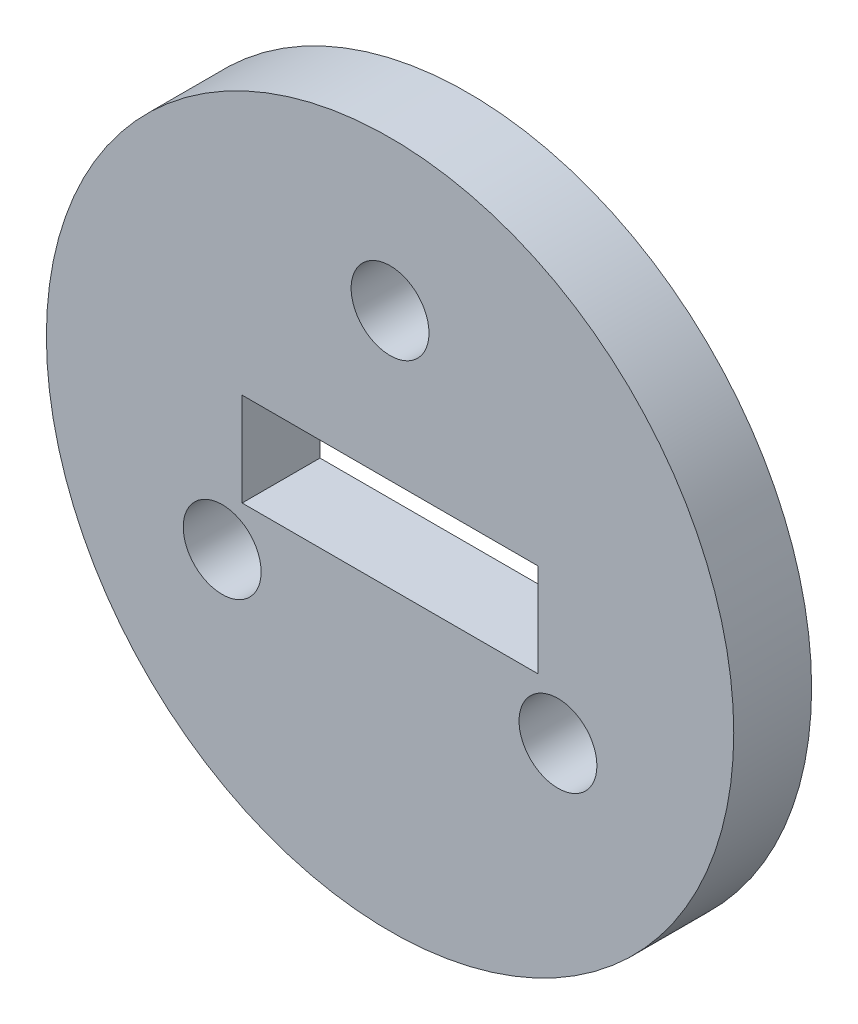
ISO-10303-21;
HEADER;
FILE_DESCRIPTION(('STEP AP214'),'2;1');
FILE_NAME('part.step','',(''),(''),'','','');
FILE_SCHEMA(('AUTOMOTIVE_DESIGN { 1 0 10303 214 1 1 1 1 }'));
ENDSEC;
DATA;
#1=APPLICATION_CONTEXT('core data for automotive mechanical design processes');
#2=APPLICATION_PROTOCOL_DEFINITION('international standard','automotive_design',2000,#1);
#3=PRODUCT_CONTEXT('',#1,'mechanical');
#4=PRODUCT('Part','Part','',(#3));
#5=PRODUCT_RELATED_PRODUCT_CATEGORY('part','',(#4));
#6=PRODUCT_DEFINITION_FORMATION('','',#4);
#7=PRODUCT_DEFINITION_CONTEXT('part definition',#1,'design');
#8=PRODUCT_DEFINITION('design','',#6,#7);
#9=PRODUCT_DEFINITION_SHAPE('','',#8);
#10=(LENGTH_UNIT() NAMED_UNIT(*) SI_UNIT(.MILLI.,.METRE.));
#11=(NAMED_UNIT(*) PLANE_ANGLE_UNIT() SI_UNIT($,.RADIAN.));
#12=(NAMED_UNIT(*) SI_UNIT($,.STERADIAN.) SOLID_ANGLE_UNIT());
#13=UNCERTAINTY_MEASURE_WITH_UNIT(LENGTH_MEASURE(1.E-05),#10,'distance_accuracy_value','');
#14=(GEOMETRIC_REPRESENTATION_CONTEXT(3) GLOBAL_UNCERTAINTY_ASSIGNED_CONTEXT((#13)) GLOBAL_UNIT_ASSIGNED_CONTEXT((#10,
#11,#12)) REPRESENTATION_CONTEXT('',''));
#15=CARTESIAN_POINT('',(0.,0.,0.));
#16=DIRECTION('',(0.,0.,1.));
#17=DIRECTION('',(1.,0.,0.));
#18=AXIS2_PLACEMENT_3D('',#15,#16,#17);
#19=CARTESIAN_POINT('',(9.5,0.,5.));
#20=DIRECTION('',(-1.,0.,0.));
#21=DIRECTION('',(0.,0.,1.));
#22=AXIS2_PLACEMENT_3D('',#19,#20,#21);
#23=PLANE('',#22);
#24=DIRECTION('',(0.,1.,0.));
#25=VECTOR('',#24,1.);
#26=CARTESIAN_POINT('',(9.5,0.,0.));
#27=LINE('',#26,#25);
#28=CARTESIAN_POINT('',(9.5,-3.,0.));
#29=VERTEX_POINT('',#28);
#30=CARTESIAN_POINT('',(9.5,3.,0.));
#31=VERTEX_POINT('',#30);
#32=EDGE_CURVE('E116',#29,#31,#27,.T.);
#33=ORIENTED_EDGE('',*,*,#32,.F.);
#34=DIRECTION('',(0.,0.,-1.));
#35=VECTOR('',#34,1.);
#36=CARTESIAN_POINT('',(9.5,-3.,5.));
#37=LINE('',#36,#35);
#38=CARTESIAN_POINT('',(9.5,-3.,5.));
#39=VERTEX_POINT('',#38);
#40=EDGE_CURVE('E11',#39,#29,#37,.T.);
#41=ORIENTED_EDGE('',*,*,#40,.F.);
#42=DIRECTION('',(0.,1.,0.));
#43=VECTOR('',#42,1.);
#44=CARTESIAN_POINT('',(9.5,0.,5.));
#45=LINE('',#44,#43);
#46=CARTESIAN_POINT('',(9.5,3.,5.));
#47=VERTEX_POINT('',#46);
#48=EDGE_CURVE('E97',#39,#47,#45,.T.);
#49=ORIENTED_EDGE('',*,*,#48,.T.);
#50=DIRECTION('',(0.,0.,-1.));
#51=VECTOR('',#50,1.);
#52=CARTESIAN_POINT('',(9.5,3.,5.));
#53=LINE('',#52,#51);
#54=EDGE_CURVE('E75',#47,#31,#53,.T.);
#55=ORIENTED_EDGE('',*,*,#54,.T.);
#56=EDGE_LOOP('',(#33,#41,#49,#55));
#57=FACE_BOUND('',#56,.T.);
#58=ADVANCED_FACE('F35',(#57),#23,.T.);
#59=CARTESIAN_POINT('',(0.,-3.,5.));
#60=DIRECTION('',(0.,1.,0.));
#61=DIRECTION('',(0.,0.,1.));
#62=AXIS2_PLACEMENT_3D('',#59,#60,#61);
#63=PLANE('',#62);
#64=DIRECTION('',(1.,0.,0.));
#65=VECTOR('',#64,1.);
#66=CARTESIAN_POINT('',(0.,-3.,0.));
#67=LINE('',#66,#65);
#68=CARTESIAN_POINT('',(-9.5,-3.,0.));
#69=VERTEX_POINT('',#68);
#70=EDGE_CURVE('E87',#69,#29,#67,.T.);
#71=ORIENTED_EDGE('',*,*,#70,.F.);
#72=DIRECTION('',(0.,0.,-1.));
#73=VECTOR('',#72,1.);
#74=CARTESIAN_POINT('',(-9.5,-3.,5.));
#75=LINE('',#74,#73);
#76=CARTESIAN_POINT('',(-9.5,-3.,5.));
#77=VERTEX_POINT('',#76);
#78=EDGE_CURVE('E44',#77,#69,#75,.T.);
#79=ORIENTED_EDGE('',*,*,#78,.F.);
#80=DIRECTION('',(1.,0.,0.));
#81=VECTOR('',#80,1.);
#82=CARTESIAN_POINT('',(0.,-3.,5.));
#83=LINE('',#82,#81);
#84=EDGE_CURVE('E85',#77,#39,#83,.T.);
#85=ORIENTED_EDGE('',*,*,#84,.T.);
#86=ORIENTED_EDGE('',*,*,#40,.T.);
#87=EDGE_LOOP('',(#71,#79,#85,#86));
#88=FACE_BOUND('',#87,.T.);
#89=ADVANCED_FACE('F83',(#88),#63,.T.);
#90=CARTESIAN_POINT('',(-9.5,0.,5.));
#91=DIRECTION('',(-1.,0.,0.));
#92=DIRECTION('',(0.,0.,1.));
#93=AXIS2_PLACEMENT_3D('',#90,#91,#92);
#94=PLANE('',#93);
#95=DIRECTION('',(0.,1.,0.));
#96=VECTOR('',#95,1.);
#97=CARTESIAN_POINT('',(-9.5,0.,0.));
#98=LINE('',#97,#96);
#99=CARTESIAN_POINT('',(-9.5,3.,0.));
#100=VERTEX_POINT('',#99);
#101=EDGE_CURVE('E119',#69,#100,#98,.T.);
#102=ORIENTED_EDGE('',*,*,#101,.T.);
#103=DIRECTION('',(0.,0.,-1.));
#104=VECTOR('',#103,1.);
#105=CARTESIAN_POINT('',(-9.5,3.,5.));
#106=LINE('',#105,#104);
#107=CARTESIAN_POINT('',(-9.5,3.,5.));
#108=VERTEX_POINT('',#107);
#109=EDGE_CURVE('E90',#108,#100,#106,.T.);
#110=ORIENTED_EDGE('',*,*,#109,.F.);
#111=DIRECTION('',(0.,1.,0.));
#112=VECTOR('',#111,1.);
#113=CARTESIAN_POINT('',(-9.5,0.,5.));
#114=LINE('',#113,#112);
#115=EDGE_CURVE('E92',#77,#108,#114,.T.);
#116=ORIENTED_EDGE('',*,*,#115,.F.);
#117=ORIENTED_EDGE('',*,*,#78,.T.);
#118=EDGE_LOOP('',(#102,#110,#116,#117));
#119=FACE_BOUND('',#118,.T.);
#120=ADVANCED_FACE('F93',(#119),#94,.F.);
#121=CARTESIAN_POINT('',(0.,12.45,5.));
#122=DIRECTION('',(0.,0.,-1.));
#123=DIRECTION('',(-1.,0.,0.));
#124=AXIS2_PLACEMENT_3D('',#121,#122,#123);
#125=CYLINDRICAL_SURFACE('',#124,2.5);
#126=CARTESIAN_POINT('',(0.,12.45,5.));
#127=DIRECTION('',(0.,0.,1.));
#128=DIRECTION('',(1.,0.,0.));
#129=AXIS2_PLACEMENT_3D('',#126,#127,#128);
#130=CIRCLE('',#129,2.5);
#131=CARTESIAN_POINT('',(2.5,12.45,5.));
#132=VERTEX_POINT('',#131);
#133=EDGE_CURVE('E104',#132,#132,#130,.T.);
#134=ORIENTED_EDGE('',*,*,#133,.T.);
#135=EDGE_LOOP('',(#134));
#136=FACE_BOUND('',#135,.T.);
#137=CARTESIAN_POINT('',(0.,12.45,0.));
#138=DIRECTION('',(0.,0.,1.));
#139=DIRECTION('',(1.,0.,0.));
#140=AXIS2_PLACEMENT_3D('',#137,#138,#139);
#141=CIRCLE('',#140,2.5);
#142=CARTESIAN_POINT('',(2.5,12.45,0.));
#143=VERTEX_POINT('',#142);
#144=EDGE_CURVE('E122',#143,#143,#141,.T.);
#145=ORIENTED_EDGE('',*,*,#144,.F.);
#146=EDGE_LOOP('',(#145));
#147=FACE_BOUND('',#146,.T.);
#148=ADVANCED_FACE('F150',(#136,#147),#125,.F.);
#149=CARTESIAN_POINT('',(0.,3.,5.));
#150=DIRECTION('',(0.,1.,0.));
#151=DIRECTION('',(0.,0.,1.));
#152=AXIS2_PLACEMENT_3D('',#149,#150,#151);
#153=PLANE('',#152);
#154=DIRECTION('',(1.,0.,0.));
#155=VECTOR('',#154,1.);
#156=CARTESIAN_POINT('',(0.,3.,0.));
#157=LINE('',#156,#155);
#158=EDGE_CURVE('E68',#100,#31,#157,.T.);
#159=ORIENTED_EDGE('',*,*,#158,.T.);
#160=ORIENTED_EDGE('',*,*,#54,.F.);
#161=DIRECTION('',(1.,0.,0.));
#162=VECTOR('',#161,1.);
#163=CARTESIAN_POINT('',(0.,3.,5.));
#164=LINE('',#163,#162);
#165=EDGE_CURVE('E52',#108,#47,#164,.T.);
#166=ORIENTED_EDGE('',*,*,#165,.F.);
#167=ORIENTED_EDGE('',*,*,#109,.T.);
#168=EDGE_LOOP('',(#159,#160,#166,#167));
#169=FACE_BOUND('',#168,.T.);
#170=ADVANCED_FACE('F131',(#169),#153,.F.);
#171=CARTESIAN_POINT('',(10.7820162771163,-6.225,5.));
#172=DIRECTION('',(0.,0.,-1.));
#173=DIRECTION('',(-1.,0.,0.));
#174=AXIS2_PLACEMENT_3D('',#171,#172,#173);
#175=CYLINDRICAL_SURFACE('',#174,2.5);
#176=CARTESIAN_POINT('',(10.7820162771163,-6.225,5.));
#177=DIRECTION('',(0.,0.,1.));
#178=DIRECTION('',(1.,0.,0.));
#179=AXIS2_PLACEMENT_3D('',#176,#177,#178);
#180=CIRCLE('',#179,2.5);
#181=CARTESIAN_POINT('',(13.2820162771163,-6.225,5.));
#182=VERTEX_POINT('',#181);
#183=EDGE_CURVE('E99',#182,#182,#180,.T.);
#184=ORIENTED_EDGE('',*,*,#183,.T.);
#185=EDGE_LOOP('',(#184));
#186=FACE_BOUND('',#185,.T.);
#187=CARTESIAN_POINT('',(10.7820162771163,-6.225,0.));
#188=DIRECTION('',(0.,0.,1.));
#189=DIRECTION('',(1.,0.,0.));
#190=AXIS2_PLACEMENT_3D('',#187,#188,#189);
#191=CIRCLE('',#190,2.5);
#192=CARTESIAN_POINT('',(13.2820162771163,-6.225,0.));
#193=VERTEX_POINT('',#192);
#194=EDGE_CURVE('E113',#193,#193,#191,.T.);
#195=ORIENTED_EDGE('',*,*,#194,.F.);
#196=EDGE_LOOP('',(#195));
#197=FACE_BOUND('',#196,.T.);
#198=ADVANCED_FACE('F141',(#186,#197),#175,.F.);
#199=CARTESIAN_POINT('',(-10.7820162771163,-6.225,5.));
#200=DIRECTION('',(0.,0.,-1.));
#201=DIRECTION('',(-1.,0.,0.));
#202=AXIS2_PLACEMENT_3D('',#199,#200,#201);
#203=CYLINDRICAL_SURFACE('',#202,2.5);
#204=CARTESIAN_POINT('',(-10.7820162771163,-6.225,5.));
#205=DIRECTION('',(0.,0.,1.));
#206=DIRECTION('',(1.,0.,0.));
#207=AXIS2_PLACEMENT_3D('',#204,#205,#206);
#208=CIRCLE('',#207,2.5);
#209=CARTESIAN_POINT('',(-8.28201627711626,-6.225,5.));
#210=VERTEX_POINT('',#209);
#211=EDGE_CURVE('E128',#210,#210,#208,.T.);
#212=ORIENTED_EDGE('',*,*,#211,.T.);
#213=EDGE_LOOP('',(#212));
#214=FACE_BOUND('',#213,.T.);
#215=CARTESIAN_POINT('',(-10.7820162771163,-6.225,0.));
#216=DIRECTION('',(0.,0.,1.));
#217=DIRECTION('',(1.,0.,0.));
#218=AXIS2_PLACEMENT_3D('',#215,#216,#217);
#219=CIRCLE('',#218,2.5);
#220=CARTESIAN_POINT('',(-8.28201627711626,-6.225,0.));
#221=VERTEX_POINT('',#220);
#222=EDGE_CURVE('E110',#221,#221,#219,.T.);
#223=ORIENTED_EDGE('',*,*,#222,.F.);
#224=EDGE_LOOP('',(#223));
#225=FACE_BOUND('',#224,.T.);
#226=ADVANCED_FACE('F37',(#214,#225),#203,.F.);
#227=CARTESIAN_POINT('',(0.,0.,5.));
#228=DIRECTION('',(0.,0.,-1.));
#229=DIRECTION('',(-1.,0.,0.));
#230=AXIS2_PLACEMENT_3D('',#227,#228,#229);
#231=CYLINDRICAL_SURFACE('',#230,22.0716390642382);
#232=CARTESIAN_POINT('',(0.,0.,5.));
#233=DIRECTION('',(0.,0.,1.));
#234=DIRECTION('',(1.,0.,0.));
#235=AXIS2_PLACEMENT_3D('',#232,#233,#234);
#236=CIRCLE('',#235,22.0716390642382);
#237=CARTESIAN_POINT('',(22.0716390642382,0.,5.));
#238=VERTEX_POINT('',#237);
#239=EDGE_CURVE('E107',#238,#238,#236,.T.);
#240=ORIENTED_EDGE('',*,*,#239,.F.);
#241=EDGE_LOOP('',(#240));
#242=FACE_BOUND('',#241,.T.);
#243=CARTESIAN_POINT('',(0.,0.,0.));
#244=DIRECTION('',(0.,0.,1.));
#245=DIRECTION('',(1.,0.,0.));
#246=AXIS2_PLACEMENT_3D('',#243,#244,#245);
#247=CIRCLE('',#246,22.0716390642382);
#248=CARTESIAN_POINT('',(22.0716390642382,0.,0.));
#249=VERTEX_POINT('',#248);
#250=EDGE_CURVE('E125',#249,#249,#247,.T.);
#251=ORIENTED_EDGE('',*,*,#250,.T.);
#252=EDGE_LOOP('',(#251));
#253=FACE_BOUND('',#252,.T.);
#254=ADVANCED_FACE('F148',(#242,#253),#231,.T.);
#255=CARTESIAN_POINT('',(0.,0.,5.));
#256=DIRECTION('',(0.,0.,1.));
#257=DIRECTION('',(1.,0.,0.));
#258=AXIS2_PLACEMENT_3D('',#255,#256,#257);
#259=PLANE('',#258);
#260=ORIENTED_EDGE('',*,*,#211,.F.);
#261=EDGE_LOOP('',(#260));
#262=FACE_BOUND('',#261,.T.);
#263=ORIENTED_EDGE('',*,*,#183,.F.);
#264=EDGE_LOOP('',(#263));
#265=FACE_BOUND('',#264,.T.);
#266=ORIENTED_EDGE('',*,*,#48,.F.);
#267=ORIENTED_EDGE('',*,*,#84,.F.);
#268=ORIENTED_EDGE('',*,*,#115,.T.);
#269=ORIENTED_EDGE('',*,*,#165,.T.);
#270=EDGE_LOOP('',(#266,#267,#268,#269));
#271=FACE_BOUND('',#270,.T.);
#272=ORIENTED_EDGE('',*,*,#133,.F.);
#273=EDGE_LOOP('',(#272));
#274=FACE_BOUND('',#273,.T.);
#275=ORIENTED_EDGE('',*,*,#239,.T.);
#276=EDGE_LOOP('',(#275));
#277=FACE_BOUND('',#276,.T.);
#278=ADVANCED_FACE('F95',(#262,#265,#271,#274,#277),#259,.T.);
#279=CARTESIAN_POINT('',(0.,0.,0.));
#280=DIRECTION('',(0.,0.,1.));
#281=DIRECTION('',(1.,0.,0.));
#282=AXIS2_PLACEMENT_3D('',#279,#280,#281);
#283=PLANE('',#282);
#284=ORIENTED_EDGE('',*,*,#222,.T.);
#285=EDGE_LOOP('',(#284));
#286=FACE_BOUND('',#285,.T.);
#287=ORIENTED_EDGE('',*,*,#194,.T.);
#288=EDGE_LOOP('',(#287));
#289=FACE_BOUND('',#288,.T.);
#290=ORIENTED_EDGE('',*,*,#32,.T.);
#291=ORIENTED_EDGE('',*,*,#158,.F.);
#292=ORIENTED_EDGE('',*,*,#101,.F.);
#293=ORIENTED_EDGE('',*,*,#70,.T.);
#294=EDGE_LOOP('',(#290,#291,#292,#293));
#295=FACE_BOUND('',#294,.T.);
#296=ORIENTED_EDGE('',*,*,#144,.T.);
#297=EDGE_LOOP('',(#296));
#298=FACE_BOUND('',#297,.T.);
#299=ORIENTED_EDGE('',*,*,#250,.F.);
#300=EDGE_LOOP('',(#299));
#301=FACE_BOUND('',#300,.T.);
#302=ADVANCED_FACE('F132',(#286,#289,#295,#298,#301),#283,.F.);
#303=CLOSED_SHELL('',(#58,#89,#120,#148,#170,#198,#226,#254,#278,#302));
#304=MANIFOLD_SOLID_BREP('B2',#303);
#305=ADVANCED_BREP_SHAPE_REPRESENTATION('',(#18,#304),#14);
#306=SHAPE_DEFINITION_REPRESENTATION(#9,#305);
ENDSEC;
END-ISO-10303-21;
